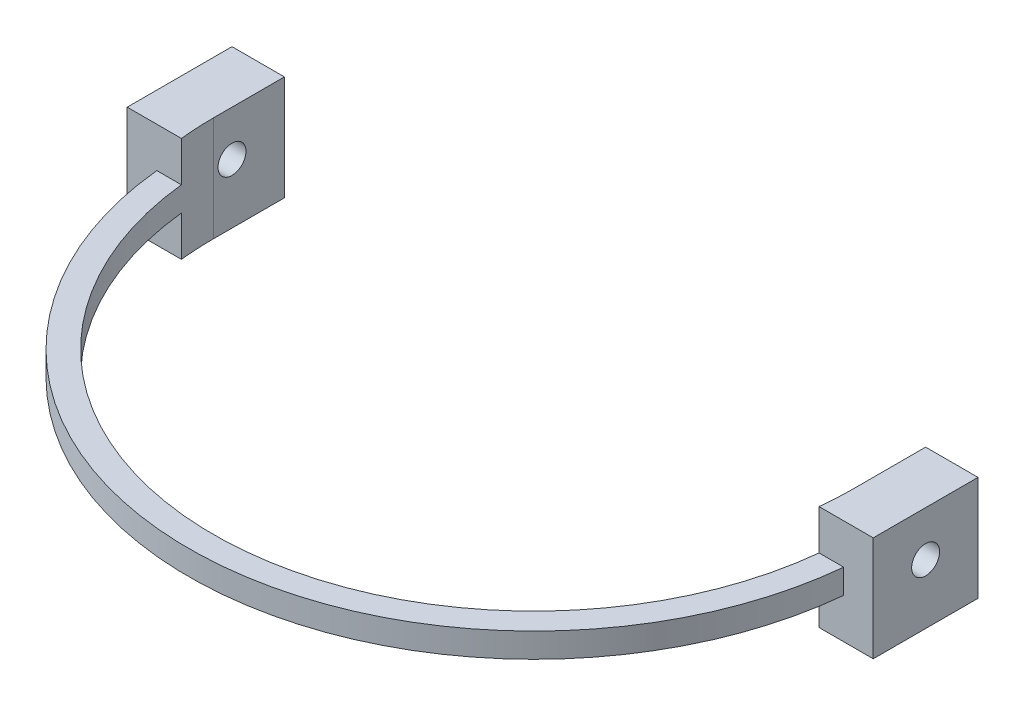
ISO-10303-21;
HEADER;
FILE_DESCRIPTION(('STEP AP214'),'2;1');
FILE_NAME('part.step','',(''),(''),'','','');
FILE_SCHEMA(('AUTOMOTIVE_DESIGN { 1 0 10303 214 1 1 1 1 }'));
ENDSEC;
DATA;
#1=APPLICATION_CONTEXT('core data for automotive mechanical design processes');
#2=APPLICATION_PROTOCOL_DEFINITION('international standard','automotive_design',2000,#1);
#3=PRODUCT_CONTEXT('',#1,'mechanical');
#4=PRODUCT('Part','Part','',(#3));
#5=PRODUCT_RELATED_PRODUCT_CATEGORY('part','',(#4));
#6=PRODUCT_DEFINITION_FORMATION('','',#4);
#7=PRODUCT_DEFINITION_CONTEXT('part definition',#1,'design');
#8=PRODUCT_DEFINITION('design','',#6,#7);
#9=PRODUCT_DEFINITION_SHAPE('','',#8);
#10=(LENGTH_UNIT() NAMED_UNIT(*) SI_UNIT(.MILLI.,.METRE.));
#11=(NAMED_UNIT(*) PLANE_ANGLE_UNIT() SI_UNIT($,.RADIAN.));
#12=(NAMED_UNIT(*) SI_UNIT($,.STERADIAN.) SOLID_ANGLE_UNIT());
#13=UNCERTAINTY_MEASURE_WITH_UNIT(LENGTH_MEASURE(1.E-05),#10,'distance_accuracy_value','');
#14=(GEOMETRIC_REPRESENTATION_CONTEXT(3) GLOBAL_UNCERTAINTY_ASSIGNED_CONTEXT((#13)) GLOBAL_UNIT_ASSIGNED_CONTEXT((#10,
#11,#12)) REPRESENTATION_CONTEXT('',''));
#15=CARTESIAN_POINT('',(0.,0.,0.));
#16=DIRECTION('',(0.,0.,1.));
#17=DIRECTION('',(1.,0.,0.));
#18=AXIS2_PLACEMENT_3D('',#15,#16,#17);
#19=CARTESIAN_POINT('',(0.,-60.,0.));
#20=DIRECTION('',(0.,1.,0.));
#21=DIRECTION('',(0.,0.,1.));
#22=AXIS2_PLACEMENT_3D('',#19,#20,#21);
#23=PLANE('',#22);
#24=DIRECTION('',(-1.,0.,0.));
#25=VECTOR('',#24,1.);
#26=CARTESIAN_POINT('',(0.,-60.,9.66920277869628));
#27=LINE('',#26,#25);
#28=CARTESIAN_POINT('',(106.805,-60.,9.66920277869628));
#29=VERTEX_POINT('',#28);
#30=CARTESIAN_POINT('',(91.2943839599373,-60.,9.66920277869628));
#31=VERTEX_POINT('',#30);
#32=EDGE_CURVE('E205',#29,#31,#27,.T.);
#33=ORIENTED_EDGE('',*,*,#32,.T.);
#34=CARTESIAN_POINT('',(0.,-60.,0.));
#35=DIRECTION('',(0.,1.,0.));
#36=DIRECTION('',(0.,0.,1.));
#37=AXIS2_PLACEMENT_3D('',#34,#35,#36);
#38=CIRCLE('',#37,91.805);
#39=CARTESIAN_POINT('',(91.805,-60.,0.));
#40=VERTEX_POINT('',#39);
#41=EDGE_CURVE('E60',#31,#40,#38,.T.);
#42=ORIENTED_EDGE('',*,*,#41,.T.);
#43=DIRECTION('',(0.,0.,-1.));
#44=VECTOR('',#43,1.);
#45=CARTESIAN_POINT('',(91.805,-60.,0.));
#46=LINE('',#45,#44);
#47=CARTESIAN_POINT('',(91.805,-60.,-20.3307972213037));
#48=VERTEX_POINT('',#47);
#49=EDGE_CURVE('E180',#40,#48,#46,.T.);
#50=ORIENTED_EDGE('',*,*,#49,.T.);
#51=DIRECTION('',(1.,0.,0.));
#52=VECTOR('',#51,1.);
#53=CARTESIAN_POINT('',(0.,-60.,-20.3307972213037));
#54=LINE('',#53,#52);
#55=CARTESIAN_POINT('',(106.805,-60.,-20.3307972213037));
#56=VERTEX_POINT('',#55);
#57=EDGE_CURVE('E183',#48,#56,#54,.T.);
#58=ORIENTED_EDGE('',*,*,#57,.T.);
#59=DIRECTION('',(0.,0.,1.));
#60=VECTOR('',#59,1.);
#61=CARTESIAN_POINT('',(106.805,-60.,0.));
#62=LINE('',#61,#60);
#63=EDGE_CURVE('E186',#56,#29,#62,.T.);
#64=ORIENTED_EDGE('',*,*,#63,.T.);
#65=EDGE_LOOP('',(#33,#42,#50,#58,#64));
#66=FACE_BOUND('',#65,.T.);
#67=ADVANCED_FACE('F37',(#66),#23,.F.);
#68=CARTESIAN_POINT('',(-106.805,-30.,98.805));
#69=DIRECTION('',(0.,-1.,0.));
#70=DIRECTION('',(1.,0.,0.));
#71=AXIS2_PLACEMENT_3D('',#68,#69,#70);
#72=PLANE('',#71);
#73=DIRECTION('',(1.,0.,0.));
#74=VECTOR('',#73,1.);
#75=CARTESIAN_POINT('',(0.,-30.,9.66920277869628));
#76=LINE('',#75,#74);
#77=CARTESIAN_POINT('',(-106.805,-30.,9.66920277869628));
#78=VERTEX_POINT('',#77);
#79=CARTESIAN_POINT('',(-91.2943839599373,-30.,9.66920277869628));
#80=VERTEX_POINT('',#79);
#81=EDGE_CURVE('E231',#78,#80,#76,.T.);
#82=ORIENTED_EDGE('',*,*,#81,.T.);
#83=CARTESIAN_POINT('',(0.,-30.,0.));
#84=DIRECTION('',(0.,-1.,0.));
#85=DIRECTION('',(1.,0.,0.));
#86=AXIS2_PLACEMENT_3D('',#83,#84,#85);
#87=CIRCLE('',#86,91.805);
#88=CARTESIAN_POINT('',(-91.805,-30.,0.));
#89=VERTEX_POINT('',#88);
#90=EDGE_CURVE('E52',#89,#80,#87,.F.);
#91=ORIENTED_EDGE('',*,*,#90,.F.);
#92=DIRECTION('',(0.,0.,-1.));
#93=VECTOR('',#92,1.);
#94=CARTESIAN_POINT('',(-91.805,-30.,0.));
#95=LINE('',#94,#93);
#96=CARTESIAN_POINT('',(-91.805,-30.,-20.3307972213037));
#97=VERTEX_POINT('',#96);
#98=EDGE_CURVE('E11',#89,#97,#95,.T.);
#99=ORIENTED_EDGE('',*,*,#98,.T.);
#100=DIRECTION('',(-1.,0.,0.));
#101=VECTOR('',#100,1.);
#102=CARTESIAN_POINT('',(0.,-30.,-20.3307972213037));
#103=LINE('',#102,#101);
#104=CARTESIAN_POINT('',(-106.805,-30.,-20.3307972213037));
#105=VERTEX_POINT('',#104);
#106=EDGE_CURVE('E218',#97,#105,#103,.T.);
#107=ORIENTED_EDGE('',*,*,#106,.T.);
#108=DIRECTION('',(0.,0.,-1.));
#109=VECTOR('',#108,1.);
#110=CARTESIAN_POINT('',(-106.805,-30.,98.805));
#111=LINE('',#110,#109);
#112=EDGE_CURVE('E214',#78,#105,#111,.T.);
#113=ORIENTED_EDGE('',*,*,#112,.F.);
#114=EDGE_LOOP('',(#82,#91,#99,#107,#113));
#115=FACE_BOUND('',#114,.T.);
#116=ADVANCED_FACE('F292',(#115),#72,.F.);
#117=CARTESIAN_POINT('',(0.,-60.,0.));
#118=DIRECTION('',(0.,1.,0.));
#119=DIRECTION('',(0.,0.,1.));
#120=AXIS2_PLACEMENT_3D('',#117,#118,#119);
#121=CYLINDRICAL_SURFACE('',#120,91.805);
#122=CARTESIAN_POINT('',(0.,-48.5,0.));
#123=DIRECTION('',(0.,1.,0.));
#124=DIRECTION('',(0.,0.,1.));
#125=AXIS2_PLACEMENT_3D('',#122,#123,#124);
#126=CIRCLE('',#125,91.805);
#127=CARTESIAN_POINT('',(91.2943839599373,-48.5,9.66920277869628));
#128=VERTEX_POINT('',#127);
#129=CARTESIAN_POINT('',(-91.2943839599373,-48.5,9.66920277869628));
#130=VERTEX_POINT('',#129);
#131=EDGE_CURVE('E314',#128,#130,#126,.F.);
#132=ORIENTED_EDGE('',*,*,#131,.T.);
#133=DIRECTION('',(0.,1.,0.));
#134=VECTOR('',#133,1.);
#135=CARTESIAN_POINT('',(-91.2943839599373,-60.,9.66920277869628));
#136=LINE('',#135,#134);
#137=CARTESIAN_POINT('',(-91.2943839599373,-60.,9.66920277869628));
#138=VERTEX_POINT('',#137);
#139=EDGE_CURVE('E156',#130,#138,#136,.F.);
#140=ORIENTED_EDGE('',*,*,#139,.T.);
#141=CARTESIAN_POINT('',(-91.805,-60.,0.));
#142=VERTEX_POINT('',#141);
#143=EDGE_CURVE('E234',#142,#138,#38,.T.);
#144=ORIENTED_EDGE('',*,*,#143,.F.);
#145=DIRECTION('',(0.,1.,0.));
#146=VECTOR('',#145,1.);
#147=CARTESIAN_POINT('',(-91.805,-60.,0.));
#148=LINE('',#147,#146);
#149=EDGE_CURVE('E178',#142,#89,#148,.T.);
#150=ORIENTED_EDGE('',*,*,#149,.T.);
#151=ORIENTED_EDGE('',*,*,#90,.T.);
#152=DIRECTION('',(0.,1.,0.));
#153=VECTOR('',#152,1.);
#154=CARTESIAN_POINT('',(-91.2943839599373,-60.,9.66920277869628));
#155=LINE('',#154,#153);
#156=CARTESIAN_POINT('',(-91.2943839599373,-41.5,9.66920277869628));
#157=VERTEX_POINT('',#156);
#158=EDGE_CURVE('E264',#80,#157,#155,.F.);
#159=ORIENTED_EDGE('',*,*,#158,.T.);
#160=CARTESIAN_POINT('',(0.,-41.5,0.));
#161=DIRECTION('',(0.,-1.,0.));
#162=DIRECTION('',(1.,0.,0.));
#163=AXIS2_PLACEMENT_3D('',#160,#161,#162);
#164=CIRCLE('',#163,91.805);
#165=CARTESIAN_POINT('',(91.2943839599373,-41.5,9.66920277869628));
#166=VERTEX_POINT('',#165);
#167=EDGE_CURVE('E261',#157,#166,#164,.F.);
#168=ORIENTED_EDGE('',*,*,#167,.T.);
#169=DIRECTION('',(0.,1.,0.));
#170=VECTOR('',#169,1.);
#171=CARTESIAN_POINT('',(91.2943839599373,-60.,9.66920277869628));
#172=LINE('',#171,#170);
#173=CARTESIAN_POINT('',(91.2943839599373,-30.,9.66920277869628));
#174=VERTEX_POINT('',#173);
#175=EDGE_CURVE('E259',#166,#174,#172,.T.);
#176=ORIENTED_EDGE('',*,*,#175,.T.);
#177=CARTESIAN_POINT('',(91.805,-30.,0.));
#178=VERTEX_POINT('',#177);
#179=EDGE_CURVE('E224',#174,#178,#87,.F.);
#180=ORIENTED_EDGE('',*,*,#179,.T.);
#181=DIRECTION('',(0.,1.,0.));
#182=VECTOR('',#181,1.);
#183=CARTESIAN_POINT('',(91.805,-60.,0.));
#184=LINE('',#183,#182);
#185=EDGE_CURVE('E46',#40,#178,#184,.T.);
#186=ORIENTED_EDGE('',*,*,#185,.F.);
#187=ORIENTED_EDGE('',*,*,#41,.F.);
#188=DIRECTION('',(0.,1.,0.));
#189=VECTOR('',#188,1.);
#190=CARTESIAN_POINT('',(91.2943839599373,-60.,9.66920277869628));
#191=LINE('',#190,#189);
#192=EDGE_CURVE('E157',#31,#128,#191,.T.);
#193=ORIENTED_EDGE('',*,*,#192,.T.);
#194=EDGE_LOOP('',(#132,#140,#144,#150,#151,#159,#168,#176,#180,#186,#187,#193));
#195=FACE_BOUND('',#194,.T.);
#196=ADVANCED_FACE('F39',(#195),#121,.F.);
#197=CARTESIAN_POINT('',(91.805,-60.,0.));
#198=DIRECTION('',(1.,0.,0.));
#199=DIRECTION('',(0.,0.,-1.));
#200=AXIS2_PLACEMENT_3D('',#197,#198,#199);
#201=PLANE('',#200);
#202=CARTESIAN_POINT('',(91.805,-42.92674227,-5.33079722130372));
#203=DIRECTION('',(1.,0.,0.));
#204=DIRECTION('',(0.,0.,-1.));
#205=AXIS2_PLACEMENT_3D('',#202,#203,#204);
#206=CIRCLE('',#205,4.00000000000001);
#207=CARTESIAN_POINT('',(91.805,-42.92674227,-9.33079722130372));
#208=VERTEX_POINT('',#207);
#209=EDGE_CURVE('E215',#208,#208,#206,.T.);
#210=ORIENTED_EDGE('',*,*,#209,.T.);
#211=EDGE_LOOP('',(#210));
#212=FACE_BOUND('',#211,.T.);
#213=ORIENTED_EDGE('',*,*,#185,.T.);
#214=DIRECTION('',(0.,0.,-1.));
#215=VECTOR('',#214,1.);
#216=CARTESIAN_POINT('',(91.805,-30.,0.));
#217=LINE('',#216,#215);
#218=CARTESIAN_POINT('',(91.805,-30.,-20.3307972213037));
#219=VERTEX_POINT('',#218);
#220=EDGE_CURVE('E226',#178,#219,#217,.T.);
#221=ORIENTED_EDGE('',*,*,#220,.T.);
#222=DIRECTION('',(0.,1.,0.));
#223=VECTOR('',#222,1.);
#224=CARTESIAN_POINT('',(91.805,-60.,-20.3307972213037));
#225=LINE('',#224,#223);
#226=EDGE_CURVE('E192',#48,#219,#225,.T.);
#227=ORIENTED_EDGE('',*,*,#226,.F.);
#228=ORIENTED_EDGE('',*,*,#49,.F.);
#229=EDGE_LOOP('',(#213,#221,#227,#228));
#230=FACE_BOUND('',#229,.T.);
#231=ADVANCED_FACE('F255',(#212,#230),#201,.F.);
#232=CARTESIAN_POINT('',(0.,-60.,-20.3307972213037));
#233=DIRECTION('',(0.,0.,1.));
#234=DIRECTION('',(1.,0.,0.));
#235=AXIS2_PLACEMENT_3D('',#232,#233,#234);
#236=PLANE('',#235);
#237=ORIENTED_EDGE('',*,*,#226,.T.);
#238=DIRECTION('',(1.,0.,0.));
#239=VECTOR('',#238,1.);
#240=CARTESIAN_POINT('',(0.,-30.,-20.3307972213037));
#241=LINE('',#240,#239);
#242=CARTESIAN_POINT('',(106.805,-30.,-20.3307972213037));
#243=VERTEX_POINT('',#242);
#244=EDGE_CURVE('E229',#219,#243,#241,.T.);
#245=ORIENTED_EDGE('',*,*,#244,.T.);
#246=DIRECTION('',(0.,1.,0.));
#247=VECTOR('',#246,1.);
#248=CARTESIAN_POINT('',(106.805,-60.,-20.3307972213037));
#249=LINE('',#248,#247);
#250=EDGE_CURVE('E195',#56,#243,#249,.T.);
#251=ORIENTED_EDGE('',*,*,#250,.F.);
#252=ORIENTED_EDGE('',*,*,#57,.F.);
#253=EDGE_LOOP('',(#237,#245,#251,#252));
#254=FACE_BOUND('',#253,.T.);
#255=ADVANCED_FACE('F250',(#254),#236,.F.);
#256=CARTESIAN_POINT('',(106.805,-60.,0.));
#257=DIRECTION('',(-1.,0.,0.));
#258=DIRECTION('',(0.,0.,1.));
#259=AXIS2_PLACEMENT_3D('',#256,#257,#258);
#260=PLANE('',#259);
#261=CARTESIAN_POINT('',(106.805,-42.92674227,-5.33079722130372));
#262=DIRECTION('',(1.,0.,0.));
#263=DIRECTION('',(0.,0.,-1.));
#264=AXIS2_PLACEMENT_3D('',#261,#262,#263);
#265=CIRCLE('',#264,4.00000000000001);
#266=CARTESIAN_POINT('',(106.805,-42.92674227,-9.33079722130372));
#267=VERTEX_POINT('',#266);
#268=EDGE_CURVE('E273',#267,#267,#265,.T.);
#269=ORIENTED_EDGE('',*,*,#268,.F.);
#270=EDGE_LOOP('',(#269));
#271=FACE_BOUND('',#270,.T.);
#272=ORIENTED_EDGE('',*,*,#250,.T.);
#273=DIRECTION('',(0.,0.,-1.));
#274=VECTOR('',#273,1.);
#275=CARTESIAN_POINT('',(106.805,-30.,98.805));
#276=LINE('',#275,#274);
#277=CARTESIAN_POINT('',(106.805,-30.,9.66920277869628));
#278=VERTEX_POINT('',#277);
#279=EDGE_CURVE('E210',#278,#243,#276,.T.);
#280=ORIENTED_EDGE('',*,*,#279,.F.);
#281=DIRECTION('',(0.,1.,0.));
#282=VECTOR('',#281,1.);
#283=CARTESIAN_POINT('',(106.805,-60.,9.66920277869628));
#284=LINE('',#283,#282);
#285=EDGE_CURVE('E166',#29,#278,#284,.T.);
#286=ORIENTED_EDGE('',*,*,#285,.F.);
#287=ORIENTED_EDGE('',*,*,#63,.F.);
#288=EDGE_LOOP('',(#272,#280,#286,#287));
#289=FACE_BOUND('',#288,.T.);
#290=ADVANCED_FACE('F209',(#271,#289),#260,.F.);
#291=CARTESIAN_POINT('',(0.,-60.,9.66920277869628));
#292=DIRECTION('',(0.,0.,-1.));
#293=DIRECTION('',(-1.,0.,0.));
#294=AXIS2_PLACEMENT_3D('',#291,#292,#293);
#295=PLANE('',#294);
#296=ORIENTED_EDGE('',*,*,#285,.T.);
#297=DIRECTION('',(-1.,0.,0.));
#298=VECTOR('',#297,1.);
#299=CARTESIAN_POINT('',(0.,-30.,9.66920277869628));
#300=LINE('',#299,#298);
#301=EDGE_CURVE('E202',#278,#174,#300,.T.);
#302=ORIENTED_EDGE('',*,*,#301,.T.);
#303=ORIENTED_EDGE('',*,*,#175,.F.);
#304=DIRECTION('',(-1.,0.,0.));
#305=VECTOR('',#304,1.);
#306=CARTESIAN_POINT('',(98.3307405780331,-41.5,9.66920277869628));
#307=LINE('',#306,#305);
#308=CARTESIAN_POINT('',(98.3307405780331,-41.5,9.66920277869628));
#309=VERTEX_POINT('',#308);
#310=EDGE_CURVE('E265',#309,#166,#307,.T.);
#311=ORIENTED_EDGE('',*,*,#310,.F.);
#312=DIRECTION('',(0.,1.,0.));
#313=VECTOR('',#312,1.);
#314=CARTESIAN_POINT('',(98.3307405780331,-60.,9.66920277869628));
#315=LINE('',#314,#313);
#316=CARTESIAN_POINT('',(98.3307405780331,-48.5,9.66920277869628));
#317=VERTEX_POINT('',#316);
#318=EDGE_CURVE('E163',#317,#309,#315,.T.);
#319=ORIENTED_EDGE('',*,*,#318,.F.);
#320=DIRECTION('',(1.,0.,0.));
#321=VECTOR('',#320,1.);
#322=CARTESIAN_POINT('',(-98.3307405780331,-48.5,9.66920277869628));
#323=LINE('',#322,#321);
#324=EDGE_CURVE('E144',#128,#317,#323,.T.);
#325=ORIENTED_EDGE('',*,*,#324,.F.);
#326=ORIENTED_EDGE('',*,*,#192,.F.);
#327=ORIENTED_EDGE('',*,*,#32,.F.);
#328=EDGE_LOOP('',(#296,#302,#303,#311,#319,#325,#326,#327));
#329=FACE_BOUND('',#328,.T.);
#330=ADVANCED_FACE('F201',(#329),#295,.F.);
#331=CARTESIAN_POINT('',(0.,-60.,0.));
#332=DIRECTION('',(0.,1.,0.));
#333=DIRECTION('',(0.,0.,1.));
#334=AXIS2_PLACEMENT_3D('',#331,#332,#333);
#335=CYLINDRICAL_SURFACE('',#334,98.805);
#336=CARTESIAN_POINT('',(0.,-48.5,0.));
#337=DIRECTION('',(0.,-1.,0.));
#338=DIRECTION('',(0.,0.,1.));
#339=AXIS2_PLACEMENT_3D('',#336,#337,#338);
#340=CIRCLE('',#339,98.805);
#341=CARTESIAN_POINT('',(-98.3307405780331,-48.5,9.66920277869628));
#342=VERTEX_POINT('',#341);
#343=EDGE_CURVE('E138',#317,#342,#340,.T.);
#344=ORIENTED_EDGE('',*,*,#343,.F.);
#345=ORIENTED_EDGE('',*,*,#318,.T.);
#346=CARTESIAN_POINT('',(0.,-41.5,0.));
#347=DIRECTION('',(0.,1.,0.));
#348=DIRECTION('',(1.,0.,0.));
#349=AXIS2_PLACEMENT_3D('',#346,#347,#348);
#350=CIRCLE('',#349,98.805);
#351=CARTESIAN_POINT('',(-98.3307405780331,-41.5,9.66920277869628));
#352=VERTEX_POINT('',#351);
#353=EDGE_CURVE('E162',#352,#309,#350,.T.);
#354=ORIENTED_EDGE('',*,*,#353,.F.);
#355=DIRECTION('',(0.,1.,0.));
#356=VECTOR('',#355,1.);
#357=CARTESIAN_POINT('',(-98.3307405780331,-60.,9.66920277869628));
#358=LINE('',#357,#356);
#359=EDGE_CURVE('E153',#342,#352,#358,.T.);
#360=ORIENTED_EDGE('',*,*,#359,.F.);
#361=EDGE_LOOP('',(#344,#345,#354,#360));
#362=FACE_BOUND('',#361,.T.);
#363=ADVANCED_FACE('F160',(#362),#335,.T.);
#364=CARTESIAN_POINT('',(0.,-60.,9.66920277869628));
#365=DIRECTION('',(0.,0.,1.));
#366=DIRECTION('',(1.,0.,0.));
#367=AXIS2_PLACEMENT_3D('',#364,#365,#366);
#368=PLANE('',#367);
#369=ORIENTED_EDGE('',*,*,#81,.F.);
#370=DIRECTION('',(0.,1.,0.));
#371=VECTOR('',#370,1.);
#372=CARTESIAN_POINT('',(-106.805,-60.,9.66920277869628));
#373=LINE('',#372,#371);
#374=CARTESIAN_POINT('',(-106.805,-60.,9.66920277869628));
#375=VERTEX_POINT('',#374);
#376=EDGE_CURVE('E164',#375,#78,#373,.T.);
#377=ORIENTED_EDGE('',*,*,#376,.F.);
#378=DIRECTION('',(1.,0.,0.));
#379=VECTOR('',#378,1.);
#380=CARTESIAN_POINT('',(0.,-60.,9.66920277869628));
#381=LINE('',#380,#379);
#382=EDGE_CURVE('E246',#375,#138,#381,.T.);
#383=ORIENTED_EDGE('',*,*,#382,.T.);
#384=ORIENTED_EDGE('',*,*,#139,.F.);
#385=EDGE_CURVE('E141',#342,#130,#323,.T.);
#386=ORIENTED_EDGE('',*,*,#385,.F.);
#387=ORIENTED_EDGE('',*,*,#359,.T.);
#388=EDGE_CURVE('E268',#157,#352,#307,.T.);
#389=ORIENTED_EDGE('',*,*,#388,.F.);
#390=ORIENTED_EDGE('',*,*,#158,.F.);
#391=EDGE_LOOP('',(#369,#377,#383,#384,#386,#387,#389,#390));
#392=FACE_BOUND('',#391,.T.);
#393=ADVANCED_FACE('F151',(#392),#368,.T.);
#394=CARTESIAN_POINT('',(-106.805,-60.,0.));
#395=DIRECTION('',(-1.,0.,0.));
#396=DIRECTION('',(0.,0.,1.));
#397=AXIS2_PLACEMENT_3D('',#394,#395,#396);
#398=PLANE('',#397);
#399=CARTESIAN_POINT('',(-106.805,-42.92674227,-5.33079722130372));
#400=DIRECTION('',(1.,0.,0.));
#401=DIRECTION('',(0.,0.,-1.));
#402=AXIS2_PLACEMENT_3D('',#399,#400,#401);
#403=CIRCLE('',#402,4.00000000000001);
#404=CARTESIAN_POINT('',(-106.805,-42.92674227,-9.33079722130372));
#405=VERTEX_POINT('',#404);
#406=EDGE_CURVE('E274',#405,#405,#403,.T.);
#407=ORIENTED_EDGE('',*,*,#406,.T.);
#408=EDGE_LOOP('',(#407));
#409=FACE_BOUND('',#408,.T.);
#410=ORIENTED_EDGE('',*,*,#112,.T.);
#411=DIRECTION('',(0.,1.,0.));
#412=VECTOR('',#411,1.);
#413=CARTESIAN_POINT('',(-106.805,-60.,-20.3307972213037));
#414=LINE('',#413,#412);
#415=CARTESIAN_POINT('',(-106.805,-60.,-20.3307972213037));
#416=VERTEX_POINT('',#415);
#417=EDGE_CURVE('E169',#416,#105,#414,.T.);
#418=ORIENTED_EDGE('',*,*,#417,.F.);
#419=DIRECTION('',(0.,0.,1.));
#420=VECTOR('',#419,1.);
#421=CARTESIAN_POINT('',(-106.805,-60.,0.));
#422=LINE('',#421,#420);
#423=EDGE_CURVE('E243',#416,#375,#422,.T.);
#424=ORIENTED_EDGE('',*,*,#423,.T.);
#425=ORIENTED_EDGE('',*,*,#376,.T.);
#426=EDGE_LOOP('',(#410,#418,#424,#425));
#427=FACE_BOUND('',#426,.T.);
#428=ADVANCED_FACE('F322',(#409,#427),#398,.T.);
#429=CARTESIAN_POINT('',(0.,-60.,-20.3307972213037));
#430=DIRECTION('',(0.,0.,-1.));
#431=DIRECTION('',(-1.,0.,0.));
#432=AXIS2_PLACEMENT_3D('',#429,#430,#431);
#433=PLANE('',#432);
#434=ORIENTED_EDGE('',*,*,#106,.F.);
#435=DIRECTION('',(0.,1.,0.));
#436=VECTOR('',#435,1.);
#437=CARTESIAN_POINT('',(-91.805,-60.,-20.3307972213037));
#438=LINE('',#437,#436);
#439=CARTESIAN_POINT('',(-91.805,-60.,-20.3307972213037));
#440=VERTEX_POINT('',#439);
#441=EDGE_CURVE('E175',#440,#97,#438,.T.);
#442=ORIENTED_EDGE('',*,*,#441,.F.);
#443=DIRECTION('',(-1.,0.,0.));
#444=VECTOR('',#443,1.);
#445=CARTESIAN_POINT('',(0.,-60.,-20.3307972213037));
#446=LINE('',#445,#444);
#447=EDGE_CURVE('E240',#440,#416,#446,.T.);
#448=ORIENTED_EDGE('',*,*,#447,.T.);
#449=ORIENTED_EDGE('',*,*,#417,.T.);
#450=EDGE_LOOP('',(#434,#442,#448,#449));
#451=FACE_BOUND('',#450,.T.);
#452=ADVANCED_FACE('F308',(#451),#433,.T.);
#453=CARTESIAN_POINT('',(-91.805,-60.,0.));
#454=DIRECTION('',(1.,0.,0.));
#455=DIRECTION('',(0.,0.,-1.));
#456=AXIS2_PLACEMENT_3D('',#453,#454,#455);
#457=PLANE('',#456);
#458=CARTESIAN_POINT('',(-91.805,-42.92674227,-5.33079722130372));
#459=DIRECTION('',(1.,0.,0.));
#460=DIRECTION('',(0.,0.,-1.));
#461=AXIS2_PLACEMENT_3D('',#458,#459,#460);
#462=CIRCLE('',#461,4.00000000000001);
#463=CARTESIAN_POINT('',(-91.805,-42.92674227,-9.33079722130372));
#464=VERTEX_POINT('',#463);
#465=EDGE_CURVE('E41',#464,#464,#462,.T.);
#466=ORIENTED_EDGE('',*,*,#465,.F.);
#467=EDGE_LOOP('',(#466));
#468=FACE_BOUND('',#467,.T.);
#469=ORIENTED_EDGE('',*,*,#98,.F.);
#470=ORIENTED_EDGE('',*,*,#149,.F.);
#471=DIRECTION('',(0.,0.,-1.));
#472=VECTOR('',#471,1.);
#473=CARTESIAN_POINT('',(-91.805,-60.,0.));
#474=LINE('',#473,#472);
#475=EDGE_CURVE('E237',#142,#440,#474,.T.);
#476=ORIENTED_EDGE('',*,*,#475,.T.);
#477=ORIENTED_EDGE('',*,*,#441,.T.);
#478=EDGE_LOOP('',(#469,#470,#476,#477));
#479=FACE_BOUND('',#478,.T.);
#480=ADVANCED_FACE('F301',(#468,#479),#457,.T.);
#481=ORIENTED_EDGE('',*,*,#143,.T.);
#482=ORIENTED_EDGE('',*,*,#382,.F.);
#483=ORIENTED_EDGE('',*,*,#423,.F.);
#484=ORIENTED_EDGE('',*,*,#447,.F.);
#485=ORIENTED_EDGE('',*,*,#475,.F.);
#486=EDGE_LOOP('',(#481,#482,#483,#484,#485));
#487=FACE_BOUND('',#486,.T.);
#488=ADVANCED_FACE('F294',(#487),#23,.F.);
#489=ORIENTED_EDGE('',*,*,#179,.F.);
#490=ORIENTED_EDGE('',*,*,#301,.F.);
#491=ORIENTED_EDGE('',*,*,#279,.T.);
#492=ORIENTED_EDGE('',*,*,#244,.F.);
#493=ORIENTED_EDGE('',*,*,#220,.F.);
#494=EDGE_LOOP('',(#489,#490,#491,#492,#493));
#495=FACE_BOUND('',#494,.T.);
#496=ADVANCED_FACE('F253',(#495),#72,.F.);
#497=CARTESIAN_POINT('',(-106.805,-42.92674227,-5.33079722130372));
#498=DIRECTION('',(1.,0.,0.));
#499=DIRECTION('',(0.,0.,-1.));
#500=AXIS2_PLACEMENT_3D('',#497,#498,#499);
#501=CYLINDRICAL_SURFACE('',#500,4.00000000000001);
#502=ORIENTED_EDGE('',*,*,#465,.T.);
#503=EDGE_LOOP('',(#502));
#504=FACE_BOUND('',#503,.T.);
#505=ORIENTED_EDGE('',*,*,#406,.F.);
#506=EDGE_LOOP('',(#505));
#507=FACE_BOUND('',#506,.T.);
#508=ADVANCED_FACE('F307',(#504,#507),#501,.F.);
#509=ORIENTED_EDGE('',*,*,#268,.T.);
#510=EDGE_LOOP('',(#509));
#511=FACE_BOUND('',#510,.T.);
#512=ORIENTED_EDGE('',*,*,#209,.F.);
#513=EDGE_LOOP('',(#512));
#514=FACE_BOUND('',#513,.T.);
#515=ADVANCED_FACE('F280',(#511,#514),#501,.F.);
#516=CARTESIAN_POINT('',(0.,-41.5,0.));
#517=DIRECTION('',(0.,-1.,0.));
#518=DIRECTION('',(1.,0.,0.));
#519=AXIS2_PLACEMENT_3D('',#516,#517,#518);
#520=PLANE('',#519);
#521=ORIENTED_EDGE('',*,*,#388,.T.);
#522=ORIENTED_EDGE('',*,*,#353,.T.);
#523=ORIENTED_EDGE('',*,*,#310,.T.);
#524=ORIENTED_EDGE('',*,*,#167,.F.);
#525=EDGE_LOOP('',(#521,#522,#523,#524));
#526=FACE_BOUND('',#525,.T.);
#527=ADVANCED_FACE('F319',(#526),#520,.F.);
#528=CARTESIAN_POINT('',(0.,-48.5,0.));
#529=DIRECTION('',(0.,1.,0.));
#530=DIRECTION('',(0.,0.,1.));
#531=AXIS2_PLACEMENT_3D('',#528,#529,#530);
#532=PLANE('',#531);
#533=ORIENTED_EDGE('',*,*,#324,.T.);
#534=ORIENTED_EDGE('',*,*,#343,.T.);
#535=ORIENTED_EDGE('',*,*,#385,.T.);
#536=ORIENTED_EDGE('',*,*,#131,.F.);
#537=EDGE_LOOP('',(#533,#534,#535,#536));
#538=FACE_BOUND('',#537,.T.);
#539=ADVANCED_FACE('F140',(#538),#532,.F.);
#540=CLOSED_SHELL('',(#67,#116,#196,#231,#255,#290,#330,#363,#393,#428,#452,#480,#488,#496,#508,
#515,#527,#539));
#541=MANIFOLD_SOLID_BREP('B2',#540);
#542=ADVANCED_BREP_SHAPE_REPRESENTATION('',(#18,#541),#14);
#543=SHAPE_DEFINITION_REPRESENTATION(#9,#542);
ENDSEC;
END-ISO-10303-21;
